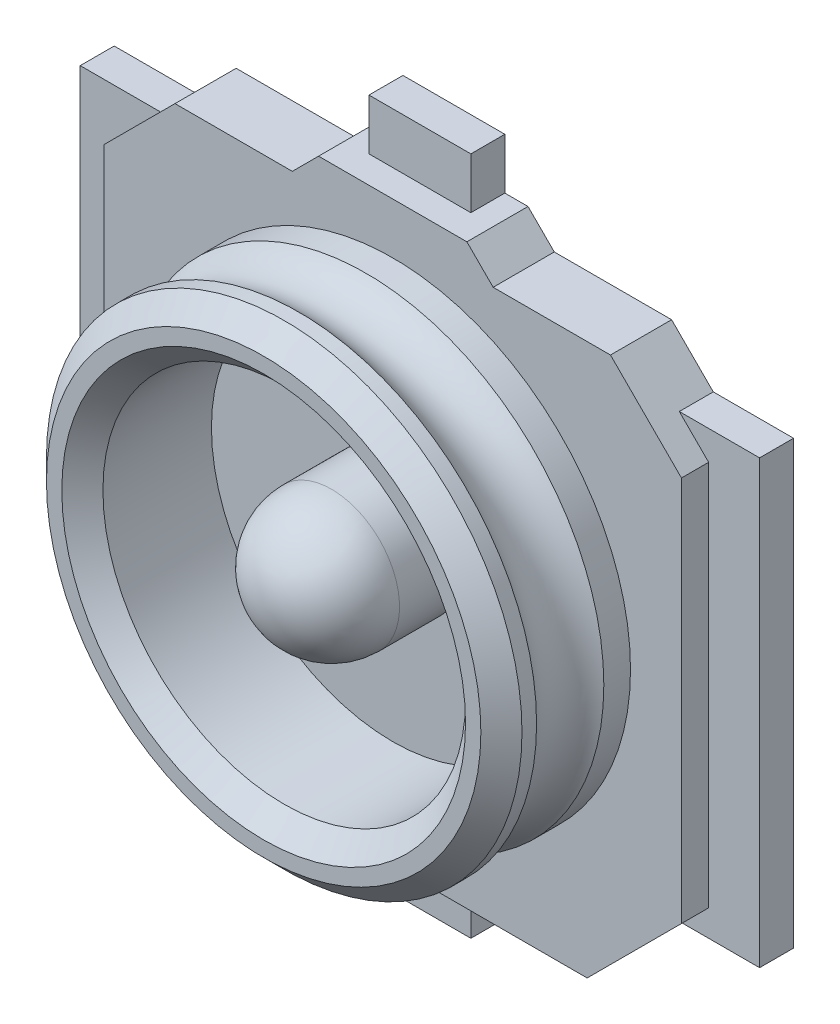
ISO-10303-21;
HEADER;
FILE_DESCRIPTION(('STEP AP214'),'2;1');
FILE_NAME('part.step','',(''),(''),'','','');
FILE_SCHEMA(('AUTOMOTIVE_DESIGN { 1 0 10303 214 1 1 1 1 }'));
ENDSEC;
DATA;
#1=APPLICATION_CONTEXT('core data for automotive mechanical design processes');
#2=APPLICATION_PROTOCOL_DEFINITION('international standard','automotive_design',2000,#1);
#3=PRODUCT_CONTEXT('',#1,'mechanical');
#4=PRODUCT('Part','Part','',(#3));
#5=PRODUCT_RELATED_PRODUCT_CATEGORY('part','',(#4));
#6=PRODUCT_DEFINITION_FORMATION('','',#4);
#7=PRODUCT_DEFINITION_CONTEXT('part definition',#1,'design');
#8=PRODUCT_DEFINITION('design','',#6,#7);
#9=PRODUCT_DEFINITION_SHAPE('','',#8);
#10=(LENGTH_UNIT() NAMED_UNIT(*) SI_UNIT(.MILLI.,.METRE.));
#11=(NAMED_UNIT(*) PLANE_ANGLE_UNIT() SI_UNIT($,.RADIAN.));
#12=(NAMED_UNIT(*) SI_UNIT($,.STERADIAN.) SOLID_ANGLE_UNIT());
#13=UNCERTAINTY_MEASURE_WITH_UNIT(LENGTH_MEASURE(1.E-05),#10,'distance_accuracy_value','');
#14=(GEOMETRIC_REPRESENTATION_CONTEXT(3) GLOBAL_UNCERTAINTY_ASSIGNED_CONTEXT((#13)) GLOBAL_UNIT_ASSIGNED_CONTEXT((#10,
#11,#12)) REPRESENTATION_CONTEXT('',''));
#15=CARTESIAN_POINT('',(0.,0.,0.));
#16=DIRECTION('',(0.,0.,1.));
#17=DIRECTION('',(1.,0.,0.));
#18=AXIS2_PLACEMENT_3D('',#15,#16,#17);
#19=CARTESIAN_POINT('',(0.,0.,0.18));
#20=DIRECTION('',(0.,0.,1.));
#21=DIRECTION('',(1.,0.,0.));
#22=AXIS2_PLACEMENT_3D('',#19,#20,#21);
#23=PLANE('',#22);
#24=DIRECTION('',(-1.,0.,0.));
#25=VECTOR('',#24,1.);
#26=CARTESIAN_POINT('',(0.,0.85,0.18));
#27=LINE('',#26,#25);
#28=CARTESIAN_POINT('',(0.218303032830049,0.85,0.18));
#29=VERTEX_POINT('',#28);
#30=CARTESIAN_POINT('',(-0.218303032830049,0.85,0.18));
#31=VERTEX_POINT('',#30);
#32=EDGE_CURVE('E434',#29,#31,#27,.T.);
#33=ORIENTED_EDGE('',*,*,#32,.T.);
#34=DIRECTION('',(-0.707106781186548,-0.707106781186547,0.));
#35=VECTOR('',#34,1.);
#36=CARTESIAN_POINT('',(-0.218303032830049,0.85,0.18));
#37=LINE('',#36,#35);
#38=CARTESIAN_POINT('',(-0.295625525450462,0.772677507379587,0.18));
#39=VERTEX_POINT('',#38);
#40=EDGE_CURVE('E438',#31,#39,#37,.T.);
#41=ORIENTED_EDGE('',*,*,#40,.T.);
#42=DIRECTION('',(-1.,0.,0.));
#43=VECTOR('',#42,1.);
#44=CARTESIAN_POINT('',(-0.295625525450462,0.772677507379587,0.18));
#45=LINE('',#44,#43);
#46=CARTESIAN_POINT('',(-0.641012318771614,0.772677507379587,0.18));
#47=VERTEX_POINT('',#46);
#48=EDGE_CURVE('E442',#39,#47,#45,.T.);
#49=ORIENTED_EDGE('',*,*,#48,.T.);
#50=DIRECTION('',(-0.707106781186548,-0.707106781186547,0.));
#51=VECTOR('',#50,1.);
#52=CARTESIAN_POINT('',(-0.641012318771614,0.772677507379587,0.18));
#53=LINE('',#52,#51);
#54=CARTESIAN_POINT('',(-0.850000000000001,0.563689826151201,0.18));
#55=VERTEX_POINT('',#54);
#56=EDGE_CURVE('E445',#47,#55,#53,.T.);
#57=ORIENTED_EDGE('',*,*,#56,.T.);
#58=DIRECTION('',(0.,-1.,0.));
#59=VECTOR('',#58,1.);
#60=CARTESIAN_POINT('',(-0.850000000000001,0.563689826151201,0.18));
#61=LINE('',#60,#59);
#62=CARTESIAN_POINT('',(-0.850000000000001,-0.57238461636168,0.18));
#63=VERTEX_POINT('',#62);
#64=EDGE_CURVE('E448',#55,#63,#61,.T.);
#65=ORIENTED_EDGE('',*,*,#64,.T.);
#66=DIRECTION('',(0.707106781186547,-0.707106781186548,0.));
#67=VECTOR('',#66,1.);
#68=CARTESIAN_POINT('',(-0.850000000000001,-0.57238461636168,0.18));
#69=LINE('',#68,#67);
#70=CARTESIAN_POINT('',(-0.572384616361681,-0.85,0.18));
#71=VERTEX_POINT('',#70);
#72=EDGE_CURVE('E451',#63,#71,#69,.T.);
#73=ORIENTED_EDGE('',*,*,#72,.T.);
#74=DIRECTION('',(1.,0.,0.));
#75=VECTOR('',#74,1.);
#76=CARTESIAN_POINT('',(-0.572384616361681,-0.85,0.18));
#77=LINE('',#76,#75);
#78=CARTESIAN_POINT('',(0.572384616361681,-0.85,0.18));
#79=VERTEX_POINT('',#78);
#80=EDGE_CURVE('E454',#71,#79,#77,.T.);
#81=ORIENTED_EDGE('',*,*,#80,.T.);
#82=DIRECTION('',(-0.707106781186547,-0.707106781186548,0.));
#83=VECTOR('',#82,1.);
#84=CARTESIAN_POINT('',(0.850000000000001,-0.57238461636168,0.18));
#85=LINE('',#84,#83);
#86=CARTESIAN_POINT('',(0.850000000000001,-0.57238461636168,0.18));
#87=VERTEX_POINT('',#86);
#88=EDGE_CURVE('E306',#87,#79,#85,.T.);
#89=ORIENTED_EDGE('',*,*,#88,.F.);
#90=DIRECTION('',(0.,-1.,0.));
#91=VECTOR('',#90,1.);
#92=CARTESIAN_POINT('',(0.850000000000001,0.563689826151201,0.18));
#93=LINE('',#92,#91);
#94=CARTESIAN_POINT('',(0.850000000000001,0.563689826151201,0.18));
#95=VERTEX_POINT('',#94);
#96=EDGE_CURVE('E302',#95,#87,#93,.T.);
#97=ORIENTED_EDGE('',*,*,#96,.F.);
#98=DIRECTION('',(0.707106781186548,-0.707106781186547,0.));
#99=VECTOR('',#98,1.);
#100=CARTESIAN_POINT('',(0.641012318771614,0.772677507379587,0.18));
#101=LINE('',#100,#99);
#102=CARTESIAN_POINT('',(0.641012318771614,0.772677507379587,0.18));
#103=VERTEX_POINT('',#102);
#104=EDGE_CURVE('E298',#103,#95,#101,.T.);
#105=ORIENTED_EDGE('',*,*,#104,.F.);
#106=DIRECTION('',(1.,0.,0.));
#107=VECTOR('',#106,1.);
#108=CARTESIAN_POINT('',(0.295625525450462,0.772677507379587,0.18));
#109=LINE('',#108,#107);
#110=CARTESIAN_POINT('',(0.295625525450462,0.772677507379587,0.18));
#111=VERTEX_POINT('',#110);
#112=EDGE_CURVE('E294',#111,#103,#109,.T.);
#113=ORIENTED_EDGE('',*,*,#112,.F.);
#114=DIRECTION('',(0.707106781186548,-0.707106781186547,0.));
#115=VECTOR('',#114,1.);
#116=CARTESIAN_POINT('',(0.218303032830049,0.85,0.18));
#117=LINE('',#116,#115);
#118=EDGE_CURVE('E290',#29,#111,#117,.T.);
#119=ORIENTED_EDGE('',*,*,#118,.F.);
#120=EDGE_LOOP('',(#33,#41,#49,#57,#65,#73,#81,#89,#97,#105,#113,#119));
#121=FACE_BOUND('',#120,.T.);
#122=CARTESIAN_POINT('',(0.,0.,0.18));
#123=DIRECTION('',(0.,0.,-1.));
#124=DIRECTION('',(-1.,0.,0.));
#125=AXIS2_PLACEMENT_3D('',#122,#123,#124);
#126=CIRCLE('',#125,0.7);
#127=CARTESIAN_POINT('',(-0.7,0.,0.18));
#128=VERTEX_POINT('',#127);
#129=EDGE_CURVE('E700',#128,#128,#126,.T.);
#130=ORIENTED_EDGE('',*,*,#129,.T.);
#131=EDGE_LOOP('',(#130));
#132=FACE_BOUND('',#131,.T.);
#133=ADVANCED_FACE('F42',(#121,#132),#23,.T.);
#134=CARTESIAN_POINT('',(-0.641012318771614,0.772677507379587,0.18));
#135=DIRECTION('',(0.707106781186547,-0.707106781186548,0.));
#136=DIRECTION('',(0.707106781186548,0.707106781186547,0.));
#137=AXIS2_PLACEMENT_3D('',#134,#135,#136);
#138=PLANE('',#137);
#139=DIRECTION('',(0.,0.,-1.));
#140=VECTOR('',#139,1.);
#141=CARTESIAN_POINT('',(-0.763689826151202,0.65,0.18));
#142=LINE('',#141,#140);
#143=CARTESIAN_POINT('',(-0.763689826151202,0.65,0.1));
#144=VERTEX_POINT('',#143);
#145=CARTESIAN_POINT('',(-0.763689826151202,0.65,0.));
#146=VERTEX_POINT('',#145);
#147=EDGE_CURVE('E51',#144,#146,#142,.T.);
#148=ORIENTED_EDGE('',*,*,#147,.F.);
#149=DIRECTION('',(0.707106781186548,0.707106781186547,0.));
#150=VECTOR('',#149,1.);
#151=CARTESIAN_POINT('',(-0.641012318771614,0.772677507379587,0.1));
#152=LINE('',#151,#150);
#153=CARTESIAN_POINT('',(-0.850000000000001,0.563689826151201,0.1));
#154=VERTEX_POINT('',#153);
#155=EDGE_CURVE('E414',#154,#144,#152,.T.);
#156=ORIENTED_EDGE('',*,*,#155,.F.);
#157=DIRECTION('',(0.,0.,-1.));
#158=VECTOR('',#157,1.);
#159=CARTESIAN_POINT('',(-0.850000000000001,0.563689826151201,0.18));
#160=LINE('',#159,#158);
#161=EDGE_CURVE('E480',#55,#154,#160,.T.);
#162=ORIENTED_EDGE('',*,*,#161,.F.);
#163=ORIENTED_EDGE('',*,*,#56,.F.);
#164=DIRECTION('',(0.,0.,-1.));
#165=VECTOR('',#164,1.);
#166=CARTESIAN_POINT('',(-0.641012318771614,0.772677507379587,0.18));
#167=LINE('',#166,#165);
#168=CARTESIAN_POINT('',(-0.641012318771614,0.772677507379587,0.));
#169=VERTEX_POINT('',#168);
#170=EDGE_CURVE('E484',#47,#169,#167,.T.);
#171=ORIENTED_EDGE('',*,*,#170,.T.);
#172=DIRECTION('',(-0.707106781186548,-0.707106781186547,0.));
#173=VECTOR('',#172,1.);
#174=CARTESIAN_POINT('',(-0.641012318771614,0.772677507379587,0.));
#175=LINE('',#174,#173);
#176=EDGE_CURVE('E62',#169,#146,#175,.T.);
#177=ORIENTED_EDGE('',*,*,#176,.T.);
#178=EDGE_LOOP('',(#148,#156,#162,#163,#171,#177));
#179=FACE_BOUND('',#178,.T.);
#180=ADVANCED_FACE('F556',(#179),#138,.F.);
#181=CARTESIAN_POINT('',(-0.850000000000001,0.563689826151201,0.18));
#182=DIRECTION('',(1.,0.,0.));
#183=DIRECTION('',(0.,0.,-1.));
#184=AXIS2_PLACEMENT_3D('',#181,#182,#183);
#185=PLANE('',#184);
#186=DIRECTION('',(0.,1.,0.));
#187=VECTOR('',#186,1.);
#188=CARTESIAN_POINT('',(-0.850000000000001,0.563689826151201,0.1));
#189=LINE('',#188,#187);
#190=CARTESIAN_POINT('',(-0.850000000000001,-0.57238461636168,0.1));
#191=VERTEX_POINT('',#190);
#192=EDGE_CURVE('E410',#191,#154,#189,.T.);
#193=ORIENTED_EDGE('',*,*,#192,.F.);
#194=DIRECTION('',(0.,0.,-1.));
#195=VECTOR('',#194,1.);
#196=CARTESIAN_POINT('',(-0.850000000000001,-0.57238461636168,0.18));
#197=LINE('',#196,#195);
#198=EDGE_CURVE('E476',#63,#191,#197,.T.);
#199=ORIENTED_EDGE('',*,*,#198,.F.);
#200=ORIENTED_EDGE('',*,*,#64,.F.);
#201=ORIENTED_EDGE('',*,*,#161,.T.);
#202=EDGE_LOOP('',(#193,#199,#200,#201));
#203=FACE_BOUND('',#202,.T.);
#204=ADVANCED_FACE('F560',(#203),#185,.F.);
#205=CARTESIAN_POINT('',(-0.850000000000001,-0.57238461636168,0.18));
#206=DIRECTION('',(0.707106781186548,0.707106781186547,0.));
#207=DIRECTION('',(-0.707106781186547,0.707106781186548,0.));
#208=AXIS2_PLACEMENT_3D('',#205,#206,#207);
#209=PLANE('',#208);
#210=DIRECTION('',(0.,0.,1.));
#211=VECTOR('',#210,1.);
#212=CARTESIAN_POINT('',(-0.77238461636168,-0.65,0.18));
#213=LINE('',#212,#211);
#214=CARTESIAN_POINT('',(-0.77238461636168,-0.65,0.));
#215=VERTEX_POINT('',#214);
#216=CARTESIAN_POINT('',(-0.77238461636168,-0.65,0.1));
#217=VERTEX_POINT('',#216);
#218=EDGE_CURVE('E531',#215,#217,#213,.T.);
#219=ORIENTED_EDGE('',*,*,#218,.F.);
#220=DIRECTION('',(0.707106781186547,-0.707106781186548,0.));
#221=VECTOR('',#220,1.);
#222=CARTESIAN_POINT('',(-0.850000000000001,-0.57238461636168,0.));
#223=LINE('',#222,#221);
#224=CARTESIAN_POINT('',(-0.572384616361681,-0.85,0.));
#225=VERTEX_POINT('',#224);
#226=EDGE_CURVE('E468',#215,#225,#223,.T.);
#227=ORIENTED_EDGE('',*,*,#226,.T.);
#228=DIRECTION('',(0.,0.,-1.));
#229=VECTOR('',#228,1.);
#230=CARTESIAN_POINT('',(-0.572384616361681,-0.85,0.18));
#231=LINE('',#230,#229);
#232=EDGE_CURVE('E457',#71,#225,#231,.T.);
#233=ORIENTED_EDGE('',*,*,#232,.F.);
#234=ORIENTED_EDGE('',*,*,#72,.F.);
#235=ORIENTED_EDGE('',*,*,#198,.T.);
#236=DIRECTION('',(-0.707106781186547,0.707106781186548,0.));
#237=VECTOR('',#236,1.);
#238=CARTESIAN_POINT('',(-0.850000000000001,-0.57238461636168,0.1));
#239=LINE('',#238,#237);
#240=EDGE_CURVE('E527',#217,#191,#239,.T.);
#241=ORIENTED_EDGE('',*,*,#240,.F.);
#242=EDGE_LOOP('',(#219,#227,#233,#234,#235,#241));
#243=FACE_BOUND('',#242,.T.);
#244=ADVANCED_FACE('F639',(#243),#209,.F.);
#245=CARTESIAN_POINT('',(-0.572384616361681,-0.85,0.18));
#246=DIRECTION('',(0.,1.,0.));
#247=DIRECTION('',(0.,0.,1.));
#248=AXIS2_PLACEMENT_3D('',#245,#246,#247);
#249=PLANE('',#248);
#250=DIRECTION('',(0.,0.,-1.));
#251=VECTOR('',#250,1.);
#252=CARTESIAN_POINT('',(-0.15,-0.85,0.18));
#253=LINE('',#252,#251);
#254=CARTESIAN_POINT('',(-0.15,-0.85,0.1));
#255=VERTEX_POINT('',#254);
#256=CARTESIAN_POINT('',(-0.15,-0.85,0.));
#257=VERTEX_POINT('',#256);
#258=EDGE_CURVE('E523',#255,#257,#253,.T.);
#259=ORIENTED_EDGE('',*,*,#258,.F.);
#260=DIRECTION('',(-1.,0.,0.));
#261=VECTOR('',#260,1.);
#262=CARTESIAN_POINT('',(-0.572384616361681,-0.85,0.1));
#263=LINE('',#262,#261);
#264=CARTESIAN_POINT('',(0.15,-0.85,0.1));
#265=VERTEX_POINT('',#264);
#266=EDGE_CURVE('E519',#265,#255,#263,.T.);
#267=ORIENTED_EDGE('',*,*,#266,.F.);
#268=DIRECTION('',(0.,0.,-1.));
#269=VECTOR('',#268,1.);
#270=CARTESIAN_POINT('',(0.15,-0.85,0.18));
#271=LINE('',#270,#269);
#272=CARTESIAN_POINT('',(0.15,-0.85,0.));
#273=VERTEX_POINT('',#272);
#274=EDGE_CURVE('E369',#265,#273,#271,.T.);
#275=ORIENTED_EDGE('',*,*,#274,.T.);
#276=DIRECTION('',(-1.,0.,0.));
#277=VECTOR('',#276,1.);
#278=CARTESIAN_POINT('',(0.572384616361681,-0.85,0.));
#279=LINE('',#278,#277);
#280=CARTESIAN_POINT('',(0.572384616361681,-0.85,0.));
#281=VERTEX_POINT('',#280);
#282=EDGE_CURVE('E295',#281,#273,#279,.T.);
#283=ORIENTED_EDGE('',*,*,#282,.F.);
#284=DIRECTION('',(0.,0.,-1.));
#285=VECTOR('',#284,1.);
#286=CARTESIAN_POINT('',(0.572384616361681,-0.85,0.18));
#287=LINE('',#286,#285);
#288=EDGE_CURVE('E310',#79,#281,#287,.T.);
#289=ORIENTED_EDGE('',*,*,#288,.F.);
#290=ORIENTED_EDGE('',*,*,#80,.F.);
#291=ORIENTED_EDGE('',*,*,#232,.T.);
#292=DIRECTION('',(1.,0.,0.));
#293=VECTOR('',#292,1.);
#294=CARTESIAN_POINT('',(-0.572384616361681,-0.85,0.));
#295=LINE('',#294,#293);
#296=EDGE_CURVE('E439',#225,#257,#295,.T.);
#297=ORIENTED_EDGE('',*,*,#296,.T.);
#298=EDGE_LOOP('',(#259,#267,#275,#283,#289,#290,#291,#297));
#299=FACE_BOUND('',#298,.T.);
#300=ADVANCED_FACE('F622',(#299),#249,.F.);
#301=CARTESIAN_POINT('',(-0.15,1.,0.1));
#302=DIRECTION('',(1.,0.,0.));
#303=DIRECTION('',(0.,0.,-1.));
#304=AXIS2_PLACEMENT_3D('',#301,#302,#303);
#305=PLANE('',#304);
#306=DIRECTION('',(0.,0.,-1.));
#307=VECTOR('',#306,1.);
#308=CARTESIAN_POINT('',(-0.15,0.85,0.1));
#309=LINE('',#308,#307);
#310=CARTESIAN_POINT('',(-0.15,0.85,0.1));
#311=VERTEX_POINT('',#310);
#312=CARTESIAN_POINT('',(-0.15,0.85,0.));
#313=VERTEX_POINT('',#312);
#314=EDGE_CURVE('E498',#311,#313,#309,.T.);
#315=ORIENTED_EDGE('',*,*,#314,.F.);
#316=DIRECTION('',(0.,-1.,0.));
#317=VECTOR('',#316,1.);
#318=CARTESIAN_POINT('',(-0.15,1.,0.1));
#319=LINE('',#318,#317);
#320=CARTESIAN_POINT('',(-0.15,1.,0.1));
#321=VERTEX_POINT('',#320);
#322=EDGE_CURVE('E506',#321,#311,#319,.T.);
#323=ORIENTED_EDGE('',*,*,#322,.F.);
#324=DIRECTION('',(0.,0.,-1.));
#325=VECTOR('',#324,1.);
#326=CARTESIAN_POINT('',(-0.15,1.,0.1));
#327=LINE('',#326,#325);
#328=CARTESIAN_POINT('',(-0.15,1.,0.));
#329=VERTEX_POINT('',#328);
#330=EDGE_CURVE('E511',#321,#329,#327,.T.);
#331=ORIENTED_EDGE('',*,*,#330,.T.);
#332=DIRECTION('',(0.,-1.,0.));
#333=VECTOR('',#332,1.);
#334=CARTESIAN_POINT('',(-0.15,1.,0.));
#335=LINE('',#334,#333);
#336=EDGE_CURVE('E507',#329,#313,#335,.T.);
#337=ORIENTED_EDGE('',*,*,#336,.T.);
#338=EDGE_LOOP('',(#315,#323,#331,#337));
#339=FACE_BOUND('',#338,.T.);
#340=ADVANCED_FACE('F584',(#339),#305,.F.);
#341=CARTESIAN_POINT('',(0.,0.,0.1));
#342=DIRECTION('',(0.,0.,1.));
#343=DIRECTION('',(1.,0.,0.));
#344=AXIS2_PLACEMENT_3D('',#341,#342,#343);
#345=PLANE('',#344);
#346=ORIENTED_EDGE('',*,*,#322,.T.);
#347=DIRECTION('',(1.,0.,0.));
#348=VECTOR('',#347,1.);
#349=CARTESIAN_POINT('',(0.,0.85,0.1));
#350=LINE('',#349,#348);
#351=CARTESIAN_POINT('',(0.15,0.85,0.1));
#352=VERTEX_POINT('',#351);
#353=EDGE_CURVE('E495',#311,#352,#350,.T.);
#354=ORIENTED_EDGE('',*,*,#353,.T.);
#355=DIRECTION('',(0.,-1.,0.));
#356=VECTOR('',#355,1.);
#357=CARTESIAN_POINT('',(0.15,1.,0.1));
#358=LINE('',#357,#356);
#359=CARTESIAN_POINT('',(0.15,1.,0.1));
#360=VERTEX_POINT('',#359);
#361=EDGE_CURVE('E358',#360,#352,#358,.T.);
#362=ORIENTED_EDGE('',*,*,#361,.F.);
#363=DIRECTION('',(-1.,0.,0.));
#364=VECTOR('',#363,1.);
#365=CARTESIAN_POINT('',(0.,1.,0.1));
#366=LINE('',#365,#364);
#367=EDGE_CURVE('E503',#360,#321,#366,.T.);
#368=ORIENTED_EDGE('',*,*,#367,.T.);
#369=EDGE_LOOP('',(#346,#354,#362,#368));
#370=FACE_BOUND('',#369,.T.);
#371=ADVANCED_FACE('F586',(#370),#345,.T.);
#372=CARTESIAN_POINT('',(0.,1.,0.1));
#373=DIRECTION('',(0.,-1.,0.));
#374=DIRECTION('',(0.,0.,-1.));
#375=AXIS2_PLACEMENT_3D('',#372,#373,#374);
#376=PLANE('',#375);
#377=DIRECTION('',(-1.,0.,0.));
#378=VECTOR('',#377,1.);
#379=CARTESIAN_POINT('',(0.,1.,0.));
#380=LINE('',#379,#378);
#381=CARTESIAN_POINT('',(0.15,1.,0.));
#382=VERTEX_POINT('',#381);
#383=EDGE_CURVE('E502',#382,#329,#380,.T.);
#384=ORIENTED_EDGE('',*,*,#383,.T.);
#385=ORIENTED_EDGE('',*,*,#330,.F.);
#386=ORIENTED_EDGE('',*,*,#367,.F.);
#387=DIRECTION('',(0.,0.,-1.));
#388=VECTOR('',#387,1.);
#389=CARTESIAN_POINT('',(0.15,1.,0.1));
#390=LINE('',#389,#388);
#391=EDGE_CURVE('E362',#360,#382,#390,.T.);
#392=ORIENTED_EDGE('',*,*,#391,.T.);
#393=EDGE_LOOP('',(#384,#385,#386,#392));
#394=FACE_BOUND('',#393,.T.);
#395=ADVANCED_FACE('F591',(#394),#376,.F.);
#396=CARTESIAN_POINT('',(0.,0.,0.));
#397=DIRECTION('',(0.,0.,1.));
#398=DIRECTION('',(1.,0.,0.));
#399=AXIS2_PLACEMENT_3D('',#396,#397,#398);
#400=PLANE('',#399);
#401=DIRECTION('',(-1.,0.,0.));
#402=VECTOR('',#401,1.);
#403=CARTESIAN_POINT('',(-1.,0.65,0.));
#404=LINE('',#403,#402);
#405=CARTESIAN_POINT('',(-1.,0.65,0.));
#406=VERTEX_POINT('',#405);
#407=EDGE_CURVE('E382',#146,#406,#404,.T.);
#408=ORIENTED_EDGE('',*,*,#407,.F.);
#409=ORIENTED_EDGE('',*,*,#176,.F.);
#410=DIRECTION('',(-1.,0.,0.));
#411=VECTOR('',#410,1.);
#412=CARTESIAN_POINT('',(-0.295625525450462,0.772677507379587,0.));
#413=LINE('',#412,#411);
#414=CARTESIAN_POINT('',(-0.295625525450462,0.772677507379587,0.));
#415=VERTEX_POINT('',#414);
#416=EDGE_CURVE('E463',#415,#169,#413,.T.);
#417=ORIENTED_EDGE('',*,*,#416,.F.);
#418=DIRECTION('',(-0.707106781186548,-0.707106781186547,0.));
#419=VECTOR('',#418,1.);
#420=CARTESIAN_POINT('',(-0.218303032830049,0.85,0.));
#421=LINE('',#420,#419);
#422=CARTESIAN_POINT('',(-0.218303032830049,0.85,0.));
#423=VERTEX_POINT('',#422);
#424=EDGE_CURVE('E460',#423,#415,#421,.T.);
#425=ORIENTED_EDGE('',*,*,#424,.F.);
#426=DIRECTION('',(-1.,0.,0.));
#427=VECTOR('',#426,1.);
#428=CARTESIAN_POINT('',(0.,0.85,0.));
#429=LINE('',#428,#427);
#430=EDGE_CURVE('E433',#313,#423,#429,.T.);
#431=ORIENTED_EDGE('',*,*,#430,.F.);
#432=ORIENTED_EDGE('',*,*,#336,.F.);
#433=ORIENTED_EDGE('',*,*,#383,.F.);
#434=DIRECTION('',(0.,-1.,0.));
#435=VECTOR('',#434,1.);
#436=CARTESIAN_POINT('',(0.15,1.,0.));
#437=LINE('',#436,#435);
#438=CARTESIAN_POINT('',(0.15,0.85,0.));
#439=VERTEX_POINT('',#438);
#440=EDGE_CURVE('E357',#382,#439,#437,.T.);
#441=ORIENTED_EDGE('',*,*,#440,.T.);
#442=DIRECTION('',(1.,0.,0.));
#443=VECTOR('',#442,1.);
#444=CARTESIAN_POINT('',(0.,0.85,0.));
#445=LINE('',#444,#443);
#446=CARTESIAN_POINT('',(0.218303032830049,0.85,0.));
#447=VERTEX_POINT('',#446);
#448=EDGE_CURVE('E289',#439,#447,#445,.T.);
#449=ORIENTED_EDGE('',*,*,#448,.T.);
#450=DIRECTION('',(0.707106781186548,-0.707106781186547,0.));
#451=VECTOR('',#450,1.);
#452=CARTESIAN_POINT('',(0.218303032830049,0.85,0.));
#453=LINE('',#452,#451);
#454=CARTESIAN_POINT('',(0.295625525450462,0.772677507379587,0.));
#455=VERTEX_POINT('',#454);
#456=EDGE_CURVE('E314',#447,#455,#453,.T.);
#457=ORIENTED_EDGE('',*,*,#456,.T.);
#458=DIRECTION('',(1.,0.,0.));
#459=VECTOR('',#458,1.);
#460=CARTESIAN_POINT('',(0.295625525450462,0.772677507379587,0.));
#461=LINE('',#460,#459);
#462=CARTESIAN_POINT('',(0.641012318771614,0.772677507379587,0.));
#463=VERTEX_POINT('',#462);
#464=EDGE_CURVE('E318',#455,#463,#461,.T.);
#465=ORIENTED_EDGE('',*,*,#464,.T.);
#466=DIRECTION('',(0.707106781186548,-0.707106781186547,0.));
#467=VECTOR('',#466,1.);
#468=CARTESIAN_POINT('',(0.641012318771614,0.772677507379587,0.));
#469=LINE('',#468,#467);
#470=CARTESIAN_POINT('',(0.763689826151202,0.65,0.));
#471=VERTEX_POINT('',#470);
#472=EDGE_CURVE('E321',#463,#471,#469,.T.);
#473=ORIENTED_EDGE('',*,*,#472,.T.);
#474=DIRECTION('',(1.,0.,0.));
#475=VECTOR('',#474,1.);
#476=CARTESIAN_POINT('',(1.,0.65,0.));
#477=LINE('',#476,#475);
#478=CARTESIAN_POINT('',(1.,0.65,0.));
#479=VERTEX_POINT('',#478);
#480=EDGE_CURVE('E265',#471,#479,#477,.T.);
#481=ORIENTED_EDGE('',*,*,#480,.T.);
#482=DIRECTION('',(0.,-1.,0.));
#483=VECTOR('',#482,1.);
#484=CARTESIAN_POINT('',(1.,-0.65,0.));
#485=LINE('',#484,#483);
#486=CARTESIAN_POINT('',(1.,-0.65,0.));
#487=VERTEX_POINT('',#486);
#488=EDGE_CURVE('E243',#479,#487,#485,.T.);
#489=ORIENTED_EDGE('',*,*,#488,.T.);
#490=DIRECTION('',(-1.,0.,0.));
#491=VECTOR('',#490,1.);
#492=CARTESIAN_POINT('',(1.,-0.65,0.));
#493=LINE('',#492,#491);
#494=CARTESIAN_POINT('',(0.77238461636168,-0.65,0.));
#495=VERTEX_POINT('',#494);
#496=EDGE_CURVE('E255',#487,#495,#493,.T.);
#497=ORIENTED_EDGE('',*,*,#496,.T.);
#498=DIRECTION('',(-0.707106781186547,-0.707106781186548,0.));
#499=VECTOR('',#498,1.);
#500=CARTESIAN_POINT('',(0.850000000000001,-0.57238461636168,0.));
#501=LINE('',#500,#499);
#502=EDGE_CURVE('E325',#495,#281,#501,.T.);
#503=ORIENTED_EDGE('',*,*,#502,.T.);
#504=ORIENTED_EDGE('',*,*,#282,.T.);
#505=DIRECTION('',(0.,-1.,0.));
#506=VECTOR('',#505,1.);
#507=CARTESIAN_POINT('',(0.15,-0.7,0.));
#508=LINE('',#507,#506);
#509=CARTESIAN_POINT('',(0.15,-1.,0.));
#510=VERTEX_POINT('',#509);
#511=EDGE_CURVE('E277',#273,#510,#508,.T.);
#512=ORIENTED_EDGE('',*,*,#511,.T.);
#513=DIRECTION('',(1.,0.,0.));
#514=VECTOR('',#513,1.);
#515=CARTESIAN_POINT('',(0.,-1.,0.));
#516=LINE('',#515,#514);
#517=CARTESIAN_POINT('',(-0.15,-1.,0.));
#518=VERTEX_POINT('',#517);
#519=EDGE_CURVE('E422',#518,#510,#516,.T.);
#520=ORIENTED_EDGE('',*,*,#519,.F.);
#521=DIRECTION('',(0.,-1.,0.));
#522=VECTOR('',#521,1.);
#523=CARTESIAN_POINT('',(-0.15,-0.7,0.));
#524=LINE('',#523,#522);
#525=EDGE_CURVE('E417',#257,#518,#524,.T.);
#526=ORIENTED_EDGE('',*,*,#525,.F.);
#527=ORIENTED_EDGE('',*,*,#296,.F.);
#528=ORIENTED_EDGE('',*,*,#226,.F.);
#529=DIRECTION('',(1.,0.,0.));
#530=VECTOR('',#529,1.);
#531=CARTESIAN_POINT('',(-1.,-0.65,0.));
#532=LINE('',#531,#530);
#533=CARTESIAN_POINT('',(-1.,-0.65,0.));
#534=VERTEX_POINT('',#533);
#535=EDGE_CURVE('E387',#534,#215,#532,.T.);
#536=ORIENTED_EDGE('',*,*,#535,.F.);
#537=DIRECTION('',(0.,-1.,0.));
#538=VECTOR('',#537,1.);
#539=CARTESIAN_POINT('',(-1.,-0.65,0.));
#540=LINE('',#539,#538);
#541=EDGE_CURVE('E397',#406,#534,#540,.T.);
#542=ORIENTED_EDGE('',*,*,#541,.F.);
#543=EDGE_LOOP('',(#408,#409,#417,#425,#431,#432,#433,#441,#449,#457,#465,#473,#481,#489,#497,
#503,#504,#512,#520,#526,#527,#528,#536,#542));
#544=FACE_BOUND('',#543,.T.);
#545=ADVANCED_FACE('F542',(#544),#400,.F.);
#546=CARTESIAN_POINT('',(0.,0.85,0.18));
#547=DIRECTION('',(0.,-1.,0.));
#548=DIRECTION('',(0.,0.,-1.));
#549=AXIS2_PLACEMENT_3D('',#546,#547,#548);
#550=PLANE('',#549);
#551=ORIENTED_EDGE('',*,*,#353,.F.);
#552=ORIENTED_EDGE('',*,*,#314,.T.);
#553=ORIENTED_EDGE('',*,*,#430,.T.);
#554=DIRECTION('',(0.,0.,-1.));
#555=VECTOR('',#554,1.);
#556=CARTESIAN_POINT('',(-0.218303032830049,0.85,0.18));
#557=LINE('',#556,#555);
#558=EDGE_CURVE('E491',#31,#423,#557,.T.);
#559=ORIENTED_EDGE('',*,*,#558,.F.);
#560=ORIENTED_EDGE('',*,*,#32,.F.);
#561=DIRECTION('',(0.,0.,-1.));
#562=VECTOR('',#561,1.);
#563=CARTESIAN_POINT('',(0.218303032830049,0.85,0.18));
#564=LINE('',#563,#562);
#565=EDGE_CURVE('E350',#29,#447,#564,.T.);
#566=ORIENTED_EDGE('',*,*,#565,.T.);
#567=ORIENTED_EDGE('',*,*,#448,.F.);
#568=DIRECTION('',(0.,0.,-1.));
#569=VECTOR('',#568,1.);
#570=CARTESIAN_POINT('',(0.15,0.85,0.1));
#571=LINE('',#570,#569);
#572=EDGE_CURVE('E353',#352,#439,#571,.T.);
#573=ORIENTED_EDGE('',*,*,#572,.F.);
#574=EDGE_LOOP('',(#551,#552,#553,#559,#560,#566,#567,#573));
#575=FACE_BOUND('',#574,.T.);
#576=ADVANCED_FACE('F579',(#575),#550,.F.);
#577=CARTESIAN_POINT('',(-0.218303032830049,0.85,0.18));
#578=DIRECTION('',(0.707106781186547,-0.707106781186548,0.));
#579=DIRECTION('',(0.707106781186548,0.707106781186547,0.));
#580=AXIS2_PLACEMENT_3D('',#577,#578,#579);
#581=PLANE('',#580);
#582=ORIENTED_EDGE('',*,*,#424,.T.);
#583=DIRECTION('',(0.,0.,-1.));
#584=VECTOR('',#583,1.);
#585=CARTESIAN_POINT('',(-0.295625525450462,0.772677507379587,0.18));
#586=LINE('',#585,#584);
#587=EDGE_CURVE('E487',#39,#415,#586,.T.);
#588=ORIENTED_EDGE('',*,*,#587,.F.);
#589=ORIENTED_EDGE('',*,*,#40,.F.);
#590=ORIENTED_EDGE('',*,*,#558,.T.);
#591=EDGE_LOOP('',(#582,#588,#589,#590));
#592=FACE_BOUND('',#591,.T.);
#593=ADVANCED_FACE('F576',(#592),#581,.F.);
#594=CARTESIAN_POINT('',(-0.295625525450462,0.772677507379587,0.18));
#595=DIRECTION('',(0.,-1.,0.));
#596=DIRECTION('',(0.,0.,-1.));
#597=AXIS2_PLACEMENT_3D('',#594,#595,#596);
#598=PLANE('',#597);
#599=ORIENTED_EDGE('',*,*,#416,.T.);
#600=ORIENTED_EDGE('',*,*,#170,.F.);
#601=ORIENTED_EDGE('',*,*,#48,.F.);
#602=ORIENTED_EDGE('',*,*,#587,.T.);
#603=EDGE_LOOP('',(#599,#600,#601,#602));
#604=FACE_BOUND('',#603,.T.);
#605=ADVANCED_FACE('F569',(#604),#598,.F.);
#606=CARTESIAN_POINT('',(-0.15,-0.7,0.1));
#607=DIRECTION('',(1.,0.,0.));
#608=DIRECTION('',(0.,1.,0.));
#609=AXIS2_PLACEMENT_3D('',#606,#607,#608);
#610=PLANE('',#609);
#611=DIRECTION('',(0.,-1.,0.));
#612=VECTOR('',#611,1.);
#613=CARTESIAN_POINT('',(-0.15,-0.7,0.1));
#614=LINE('',#613,#612);
#615=CARTESIAN_POINT('',(-0.15,-1.,0.1));
#616=VERTEX_POINT('',#615);
#617=EDGE_CURVE('E418',#255,#616,#614,.T.);
#618=ORIENTED_EDGE('',*,*,#617,.F.);
#619=ORIENTED_EDGE('',*,*,#258,.T.);
#620=ORIENTED_EDGE('',*,*,#525,.T.);
#621=DIRECTION('',(0.,0.,-1.));
#622=VECTOR('',#621,1.);
#623=CARTESIAN_POINT('',(-0.15,-1.,0.1));
#624=LINE('',#623,#622);
#625=EDGE_CURVE('E425',#616,#518,#624,.T.);
#626=ORIENTED_EDGE('',*,*,#625,.F.);
#627=EDGE_LOOP('',(#618,#619,#620,#626));
#628=FACE_BOUND('',#627,.T.);
#629=ADVANCED_FACE('F636',(#628),#610,.F.);
#630=CARTESIAN_POINT('',(0.,0.,0.1));
#631=DIRECTION('',(0.,0.,-1.));
#632=DIRECTION('',(-1.,0.,0.));
#633=AXIS2_PLACEMENT_3D('',#630,#631,#632);
#634=PLANE('',#633);
#635=DIRECTION('',(1.,0.,0.));
#636=VECTOR('',#635,1.);
#637=CARTESIAN_POINT('',(0.,-1.,0.1));
#638=LINE('',#637,#636);
#639=CARTESIAN_POINT('',(0.15,-1.,0.1));
#640=VERTEX_POINT('',#639);
#641=EDGE_CURVE('E421',#616,#640,#638,.T.);
#642=ORIENTED_EDGE('',*,*,#641,.T.);
#643=DIRECTION('',(0.,-1.,0.));
#644=VECTOR('',#643,1.);
#645=CARTESIAN_POINT('',(0.15,-0.7,0.1));
#646=LINE('',#645,#644);
#647=EDGE_CURVE('E278',#265,#640,#646,.T.);
#648=ORIENTED_EDGE('',*,*,#647,.F.);
#649=ORIENTED_EDGE('',*,*,#266,.T.);
#650=ORIENTED_EDGE('',*,*,#617,.T.);
#651=EDGE_LOOP('',(#642,#648,#649,#650));
#652=FACE_BOUND('',#651,.T.);
#653=ADVANCED_FACE('F777',(#652),#634,.F.);
#654=CARTESIAN_POINT('',(0.,-1.,0.1));
#655=DIRECTION('',(0.,1.,0.));
#656=DIRECTION('',(0.,0.,1.));
#657=AXIS2_PLACEMENT_3D('',#654,#655,#656);
#658=PLANE('',#657);
#659=ORIENTED_EDGE('',*,*,#519,.T.);
#660=DIRECTION('',(0.,0.,-1.));
#661=VECTOR('',#660,1.);
#662=CARTESIAN_POINT('',(0.15,-1.,0.1));
#663=LINE('',#662,#661);
#664=EDGE_CURVE('E282',#640,#510,#663,.T.);
#665=ORIENTED_EDGE('',*,*,#664,.F.);
#666=ORIENTED_EDGE('',*,*,#641,.F.);
#667=ORIENTED_EDGE('',*,*,#625,.T.);
#668=EDGE_LOOP('',(#659,#665,#666,#667));
#669=FACE_BOUND('',#668,.T.);
#670=ADVANCED_FACE('F632',(#669),#658,.F.);
#671=CARTESIAN_POINT('',(-1.,0.65,0.1));
#672=DIRECTION('',(0.,-1.,0.));
#673=DIRECTION('',(0.,0.,-1.));
#674=AXIS2_PLACEMENT_3D('',#671,#672,#673);
#675=PLANE('',#674);
#676=DIRECTION('',(-1.,0.,0.));
#677=VECTOR('',#676,1.);
#678=CARTESIAN_POINT('',(-1.,0.65,0.1));
#679=LINE('',#678,#677);
#680=CARTESIAN_POINT('',(-1.,0.65,0.1));
#681=VERTEX_POINT('',#680);
#682=EDGE_CURVE('E383',#144,#681,#679,.T.);
#683=ORIENTED_EDGE('',*,*,#682,.F.);
#684=ORIENTED_EDGE('',*,*,#147,.T.);
#685=ORIENTED_EDGE('',*,*,#407,.T.);
#686=DIRECTION('',(0.,0.,-1.));
#687=VECTOR('',#686,1.);
#688=CARTESIAN_POINT('',(-1.,0.65,0.1));
#689=LINE('',#688,#687);
#690=EDGE_CURVE('E406',#681,#406,#689,.T.);
#691=ORIENTED_EDGE('',*,*,#690,.F.);
#692=EDGE_LOOP('',(#683,#684,#685,#691));
#693=FACE_BOUND('',#692,.T.);
#694=ADVANCED_FACE('F538',(#693),#675,.F.);
#695=CARTESIAN_POINT('',(-1.,-0.65,0.1));
#696=DIRECTION('',(0.,1.,0.));
#697=DIRECTION('',(0.,0.,1.));
#698=AXIS2_PLACEMENT_3D('',#695,#696,#697);
#699=PLANE('',#698);
#700=ORIENTED_EDGE('',*,*,#535,.T.);
#701=ORIENTED_EDGE('',*,*,#218,.T.);
#702=DIRECTION('',(1.,0.,0.));
#703=VECTOR('',#702,1.);
#704=CARTESIAN_POINT('',(-1.,-0.65,0.1));
#705=LINE('',#704,#703);
#706=CARTESIAN_POINT('',(-1.,-0.65,0.1));
#707=VERTEX_POINT('',#706);
#708=EDGE_CURVE('E390',#707,#217,#705,.T.);
#709=ORIENTED_EDGE('',*,*,#708,.F.);
#710=DIRECTION('',(0.,0.,-1.));
#711=VECTOR('',#710,1.);
#712=CARTESIAN_POINT('',(-1.,-0.65,0.1));
#713=LINE('',#712,#711);
#714=EDGE_CURVE('E394',#707,#534,#713,.T.);
#715=ORIENTED_EDGE('',*,*,#714,.T.);
#716=EDGE_LOOP('',(#700,#701,#709,#715));
#717=FACE_BOUND('',#716,.T.);
#718=ADVANCED_FACE('F551',(#717),#699,.F.);
#719=CARTESIAN_POINT('',(0.,0.,0.1));
#720=DIRECTION('',(0.,0.,-1.));
#721=DIRECTION('',(-1.,0.,0.));
#722=AXIS2_PLACEMENT_3D('',#719,#720,#721);
#723=PLANE('',#722);
#724=ORIENTED_EDGE('',*,*,#192,.T.);
#725=ORIENTED_EDGE('',*,*,#155,.T.);
#726=ORIENTED_EDGE('',*,*,#682,.T.);
#727=DIRECTION('',(0.,-1.,0.));
#728=VECTOR('',#727,1.);
#729=CARTESIAN_POINT('',(-1.,-0.65,0.1));
#730=LINE('',#729,#728);
#731=EDGE_CURVE('E386',#681,#707,#730,.T.);
#732=ORIENTED_EDGE('',*,*,#731,.T.);
#733=ORIENTED_EDGE('',*,*,#708,.T.);
#734=ORIENTED_EDGE('',*,*,#240,.T.);
#735=EDGE_LOOP('',(#724,#725,#726,#732,#733,#734));
#736=FACE_BOUND('',#735,.T.);
#737=ADVANCED_FACE('F554',(#736),#723,.F.);
#738=CARTESIAN_POINT('',(-1.,-0.65,0.1));
#739=DIRECTION('',(1.,0.,0.));
#740=DIRECTION('',(0.,1.,0.));
#741=AXIS2_PLACEMENT_3D('',#738,#739,#740);
#742=PLANE('',#741);
#743=ORIENTED_EDGE('',*,*,#541,.T.);
#744=ORIENTED_EDGE('',*,*,#714,.F.);
#745=ORIENTED_EDGE('',*,*,#731,.F.);
#746=ORIENTED_EDGE('',*,*,#690,.T.);
#747=EDGE_LOOP('',(#743,#744,#745,#746));
#748=FACE_BOUND('',#747,.T.);
#749=ADVANCED_FACE('F547',(#748),#742,.F.);
#750=CARTESIAN_POINT('',(0.641012318771614,0.772677507379587,0.18));
#751=DIRECTION('',(-0.707106781186547,-0.707106781186548,0.));
#752=DIRECTION('',(-0.707106781186548,0.707106781186547,0.));
#753=AXIS2_PLACEMENT_3D('',#750,#751,#752);
#754=PLANE('',#753);
#755=DIRECTION('',(0.,0.,-1.));
#756=VECTOR('',#755,1.);
#757=CARTESIAN_POINT('',(0.763689826151202,0.65,0.18));
#758=LINE('',#757,#756);
#759=CARTESIAN_POINT('',(0.763689826151202,0.65,0.1));
#760=VERTEX_POINT('',#759);
#761=EDGE_CURVE('E253',#760,#471,#758,.T.);
#762=ORIENTED_EDGE('',*,*,#761,.T.);
#763=ORIENTED_EDGE('',*,*,#472,.F.);
#764=DIRECTION('',(0.,0.,-1.));
#765=VECTOR('',#764,1.);
#766=CARTESIAN_POINT('',(0.641012318771614,0.772677507379587,0.18));
#767=LINE('',#766,#765);
#768=EDGE_CURVE('E343',#103,#463,#767,.T.);
#769=ORIENTED_EDGE('',*,*,#768,.F.);
#770=ORIENTED_EDGE('',*,*,#104,.T.);
#771=DIRECTION('',(0.,0.,-1.));
#772=VECTOR('',#771,1.);
#773=CARTESIAN_POINT('',(0.850000000000001,0.563689826151201,0.18));
#774=LINE('',#773,#772);
#775=CARTESIAN_POINT('',(0.850000000000001,0.563689826151201,0.1));
#776=VERTEX_POINT('',#775);
#777=EDGE_CURVE('E339',#95,#776,#774,.T.);
#778=ORIENTED_EDGE('',*,*,#777,.T.);
#779=DIRECTION('',(-0.707106781186548,0.707106781186547,0.));
#780=VECTOR('',#779,1.);
#781=CARTESIAN_POINT('',(0.641012318771614,0.772677507379587,0.1));
#782=LINE('',#781,#780);
#783=EDGE_CURVE('E274',#776,#760,#782,.T.);
#784=ORIENTED_EDGE('',*,*,#783,.T.);
#785=EDGE_LOOP('',(#762,#763,#769,#770,#778,#784));
#786=FACE_BOUND('',#785,.T.);
#787=ADVANCED_FACE('F607',(#786),#754,.F.);
#788=CARTESIAN_POINT('',(0.850000000000001,0.563689826151201,0.18));
#789=DIRECTION('',(-1.,0.,0.));
#790=DIRECTION('',(0.,0.,-1.));
#791=AXIS2_PLACEMENT_3D('',#788,#789,#790);
#792=PLANE('',#791);
#793=DIRECTION('',(0.,1.,0.));
#794=VECTOR('',#793,1.);
#795=CARTESIAN_POINT('',(0.850000000000001,0.563689826151201,0.1));
#796=LINE('',#795,#794);
#797=CARTESIAN_POINT('',(0.850000000000001,-0.57238461636168,0.1));
#798=VERTEX_POINT('',#797);
#799=EDGE_CURVE('E247',#798,#776,#796,.T.);
#800=ORIENTED_EDGE('',*,*,#799,.T.);
#801=ORIENTED_EDGE('',*,*,#777,.F.);
#802=ORIENTED_EDGE('',*,*,#96,.T.);
#803=DIRECTION('',(0.,0.,-1.));
#804=VECTOR('',#803,1.);
#805=CARTESIAN_POINT('',(0.850000000000001,-0.57238461636168,0.18));
#806=LINE('',#805,#804);
#807=EDGE_CURVE('E335',#87,#798,#806,.T.);
#808=ORIENTED_EDGE('',*,*,#807,.T.);
#809=EDGE_LOOP('',(#800,#801,#802,#808));
#810=FACE_BOUND('',#809,.T.);
#811=ADVANCED_FACE('F618',(#810),#792,.F.);
#812=CARTESIAN_POINT('',(0.850000000000001,-0.57238461636168,0.18));
#813=DIRECTION('',(-0.707106781186548,0.707106781186547,0.));
#814=DIRECTION('',(0.707106781186547,0.707106781186548,0.));
#815=AXIS2_PLACEMENT_3D('',#812,#813,#814);
#816=PLANE('',#815);
#817=DIRECTION('',(0.,0.,1.));
#818=VECTOR('',#817,1.);
#819=CARTESIAN_POINT('',(0.77238461636168,-0.65,0.18));
#820=LINE('',#819,#818);
#821=CARTESIAN_POINT('',(0.77238461636168,-0.65,0.1));
#822=VERTEX_POINT('',#821);
#823=EDGE_CURVE('E376',#495,#822,#820,.T.);
#824=ORIENTED_EDGE('',*,*,#823,.T.);
#825=DIRECTION('',(0.707106781186547,0.707106781186548,0.));
#826=VECTOR('',#825,1.);
#827=CARTESIAN_POINT('',(0.850000000000001,-0.57238461636168,0.1));
#828=LINE('',#827,#826);
#829=EDGE_CURVE('E373',#822,#798,#828,.T.);
#830=ORIENTED_EDGE('',*,*,#829,.T.);
#831=ORIENTED_EDGE('',*,*,#807,.F.);
#832=ORIENTED_EDGE('',*,*,#88,.T.);
#833=ORIENTED_EDGE('',*,*,#288,.T.);
#834=ORIENTED_EDGE('',*,*,#502,.F.);
#835=EDGE_LOOP('',(#824,#830,#831,#832,#833,#834));
#836=FACE_BOUND('',#835,.T.);
#837=ADVANCED_FACE('F613',(#836),#816,.F.);
#838=CARTESIAN_POINT('',(0.15,1.,0.1));
#839=DIRECTION('',(-1.,0.,0.));
#840=DIRECTION('',(0.,0.,-1.));
#841=AXIS2_PLACEMENT_3D('',#838,#839,#840);
#842=PLANE('',#841);
#843=ORIENTED_EDGE('',*,*,#572,.T.);
#844=ORIENTED_EDGE('',*,*,#440,.F.);
#845=ORIENTED_EDGE('',*,*,#391,.F.);
#846=ORIENTED_EDGE('',*,*,#361,.T.);
#847=EDGE_LOOP('',(#843,#844,#845,#846));
#848=FACE_BOUND('',#847,.T.);
#849=ADVANCED_FACE('F594',(#848),#842,.F.);
#850=CARTESIAN_POINT('',(0.218303032830049,0.85,0.18));
#851=DIRECTION('',(-0.707106781186547,-0.707106781186548,0.));
#852=DIRECTION('',(-0.707106781186548,0.707106781186547,0.));
#853=AXIS2_PLACEMENT_3D('',#850,#851,#852);
#854=PLANE('',#853);
#855=ORIENTED_EDGE('',*,*,#456,.F.);
#856=ORIENTED_EDGE('',*,*,#565,.F.);
#857=ORIENTED_EDGE('',*,*,#118,.T.);
#858=DIRECTION('',(0.,0.,-1.));
#859=VECTOR('',#858,1.);
#860=CARTESIAN_POINT('',(0.295625525450462,0.772677507379587,0.18));
#861=LINE('',#860,#859);
#862=EDGE_CURVE('E347',#111,#455,#861,.T.);
#863=ORIENTED_EDGE('',*,*,#862,.T.);
#864=EDGE_LOOP('',(#855,#856,#857,#863));
#865=FACE_BOUND('',#864,.T.);
#866=ADVANCED_FACE('F599',(#865),#854,.F.);
#867=CARTESIAN_POINT('',(0.295625525450462,0.772677507379587,0.18));
#868=DIRECTION('',(0.,-1.,0.));
#869=DIRECTION('',(0.,0.,-1.));
#870=AXIS2_PLACEMENT_3D('',#867,#868,#869);
#871=PLANE('',#870);
#872=ORIENTED_EDGE('',*,*,#464,.F.);
#873=ORIENTED_EDGE('',*,*,#862,.F.);
#874=ORIENTED_EDGE('',*,*,#112,.T.);
#875=ORIENTED_EDGE('',*,*,#768,.T.);
#876=EDGE_LOOP('',(#872,#873,#874,#875));
#877=FACE_BOUND('',#876,.T.);
#878=ADVANCED_FACE('F602',(#877),#871,.F.);
#879=CARTESIAN_POINT('',(0.15,-0.7,0.1));
#880=DIRECTION('',(-1.,0.,0.));
#881=DIRECTION('',(0.,1.,0.));
#882=AXIS2_PLACEMENT_3D('',#879,#880,#881);
#883=PLANE('',#882);
#884=ORIENTED_EDGE('',*,*,#647,.T.);
#885=ORIENTED_EDGE('',*,*,#664,.T.);
#886=ORIENTED_EDGE('',*,*,#511,.F.);
#887=ORIENTED_EDGE('',*,*,#274,.F.);
#888=EDGE_LOOP('',(#884,#885,#886,#887));
#889=FACE_BOUND('',#888,.T.);
#890=ADVANCED_FACE('F627',(#889),#883,.F.);
#891=CARTESIAN_POINT('',(1.,0.65,0.1));
#892=DIRECTION('',(0.,-1.,0.));
#893=DIRECTION('',(0.,0.,-1.));
#894=AXIS2_PLACEMENT_3D('',#891,#892,#893);
#895=PLANE('',#894);
#896=DIRECTION('',(1.,0.,0.));
#897=VECTOR('',#896,1.);
#898=CARTESIAN_POINT('',(1.,0.65,0.1));
#899=LINE('',#898,#897);
#900=CARTESIAN_POINT('',(1.,0.65,0.1));
#901=VERTEX_POINT('',#900);
#902=EDGE_CURVE('E231',#760,#901,#899,.T.);
#903=ORIENTED_EDGE('',*,*,#902,.T.);
#904=DIRECTION('',(0.,0.,-1.));
#905=VECTOR('',#904,1.);
#906=CARTESIAN_POINT('',(1.,0.65,0.1));
#907=LINE('',#906,#905);
#908=EDGE_CURVE('E240',#901,#479,#907,.T.);
#909=ORIENTED_EDGE('',*,*,#908,.T.);
#910=ORIENTED_EDGE('',*,*,#480,.F.);
#911=ORIENTED_EDGE('',*,*,#761,.F.);
#912=EDGE_LOOP('',(#903,#909,#910,#911));
#913=FACE_BOUND('',#912,.T.);
#914=ADVANCED_FACE('F251',(#913),#895,.F.);
#915=CARTESIAN_POINT('',(1.,-0.65,0.1));
#916=DIRECTION('',(0.,1.,0.));
#917=DIRECTION('',(0.,0.,1.));
#918=AXIS2_PLACEMENT_3D('',#915,#916,#917);
#919=PLANE('',#918);
#920=ORIENTED_EDGE('',*,*,#496,.F.);
#921=DIRECTION('',(0.,0.,-1.));
#922=VECTOR('',#921,1.);
#923=CARTESIAN_POINT('',(1.,-0.65,0.1));
#924=LINE('',#923,#922);
#925=CARTESIAN_POINT('',(1.,-0.65,0.1));
#926=VERTEX_POINT('',#925);
#927=EDGE_CURVE('E248',#926,#487,#924,.T.);
#928=ORIENTED_EDGE('',*,*,#927,.F.);
#929=DIRECTION('',(-1.,0.,0.));
#930=VECTOR('',#929,1.);
#931=CARTESIAN_POINT('',(1.,-0.65,0.1));
#932=LINE('',#931,#930);
#933=EDGE_CURVE('E234',#926,#822,#932,.T.);
#934=ORIENTED_EDGE('',*,*,#933,.T.);
#935=ORIENTED_EDGE('',*,*,#823,.F.);
#936=EDGE_LOOP('',(#920,#928,#934,#935));
#937=FACE_BOUND('',#936,.T.);
#938=ADVANCED_FACE('F615',(#937),#919,.F.);
#939=CARTESIAN_POINT('',(0.,0.,0.1));
#940=DIRECTION('',(0.,0.,-1.));
#941=DIRECTION('',(1.,0.,0.));
#942=AXIS2_PLACEMENT_3D('',#939,#940,#941);
#943=PLANE('',#942);
#944=ORIENTED_EDGE('',*,*,#799,.F.);
#945=ORIENTED_EDGE('',*,*,#829,.F.);
#946=ORIENTED_EDGE('',*,*,#933,.F.);
#947=DIRECTION('',(0.,-1.,0.));
#948=VECTOR('',#947,1.);
#949=CARTESIAN_POINT('',(1.,-0.65,0.1));
#950=LINE('',#949,#948);
#951=EDGE_CURVE('E225',#901,#926,#950,.T.);
#952=ORIENTED_EDGE('',*,*,#951,.F.);
#953=ORIENTED_EDGE('',*,*,#902,.F.);
#954=ORIENTED_EDGE('',*,*,#783,.F.);
#955=EDGE_LOOP('',(#944,#945,#946,#952,#953,#954));
#956=FACE_BOUND('',#955,.T.);
#957=ADVANCED_FACE('F228',(#956),#943,.F.);
#958=CARTESIAN_POINT('',(1.,-0.65,0.1));
#959=DIRECTION('',(-1.,0.,0.));
#960=DIRECTION('',(0.,1.,0.));
#961=AXIS2_PLACEMENT_3D('',#958,#959,#960);
#962=PLANE('',#961);
#963=ORIENTED_EDGE('',*,*,#488,.F.);
#964=ORIENTED_EDGE('',*,*,#908,.F.);
#965=ORIENTED_EDGE('',*,*,#951,.T.);
#966=ORIENTED_EDGE('',*,*,#927,.T.);
#967=EDGE_LOOP('',(#963,#964,#965,#966));
#968=FACE_BOUND('',#967,.T.);
#969=ADVANCED_FACE('F241',(#968),#962,.F.);
#970=CARTESIAN_POINT('',(0.,0.,0.18));
#971=DIRECTION('',(0.,0.,-1.));
#972=DIRECTION('',(-1.,0.,0.));
#973=AXIS2_PLACEMENT_3D('',#970,#971,#972);
#974=CYLINDRICAL_SURFACE('',#973,0.7);
#975=ORIENTED_EDGE('',*,*,#129,.F.);
#976=EDGE_LOOP('',(#975));
#977=FACE_BOUND('',#976,.T.);
#978=CARTESIAN_POINT('',(0.,0.,0.258546013102248));
#979=DIRECTION('',(0.,0.,-1.));
#980=DIRECTION('',(-1.,0.,0.));
#981=AXIS2_PLACEMENT_3D('',#978,#979,#980);
#982=CIRCLE('',#981,0.7);
#983=CARTESIAN_POINT('',(-0.7,0.,0.258546013102249));
#984=VERTEX_POINT('',#983);
#985=EDGE_CURVE('E697',#984,#984,#982,.T.);
#986=ORIENTED_EDGE('',*,*,#985,.T.);
#987=EDGE_LOOP('',(#986));
#988=FACE_BOUND('',#987,.T.);
#989=ADVANCED_FACE('F706',(#977,#988),#974,.T.);
#990=CARTESIAN_POINT('',(0.,0.,0.357515967691919));
#991=DIRECTION('',(0.,0.,-1.));
#992=DIRECTION('',(-1.,0.,0.));
#993=AXIS2_PLACEMENT_3D('',#990,#991,#992);
#994=TOROIDAL_SURFACE('',#993,0.778362732878557,0.126236958992513);
#995=ORIENTED_EDGE('',*,*,#985,.F.);
#996=EDGE_LOOP('',(#995));
#997=FACE_BOUND('',#996,.T.);
#998=CARTESIAN_POINT('',(0.,0.,0.456485922281589));
#999=DIRECTION('',(0.,0.,-1.));
#1000=DIRECTION('',(-1.,0.,0.));
#1001=AXIS2_PLACEMENT_3D('',#998,#999,#1000);
#1002=CIRCLE('',#1001,0.7);
#1003=CARTESIAN_POINT('',(-0.7,0.,0.456485922281589));
#1004=VERTEX_POINT('',#1003);
#1005=EDGE_CURVE('E693',#1004,#1004,#1002,.T.);
#1006=ORIENTED_EDGE('',*,*,#1005,.T.);
#1007=EDGE_LOOP('',(#1006));
#1008=FACE_BOUND('',#1007,.T.);
#1009=ADVANCED_FACE('F709',(#997,#1008),#994,.F.);
#1010=CARTESIAN_POINT('',(0.,0.,0.18));
#1011=DIRECTION('',(0.,0.,-1.));
#1012=DIRECTION('',(-1.,0.,0.));
#1013=AXIS2_PLACEMENT_3D('',#1010,#1011,#1012);
#1014=CYLINDRICAL_SURFACE('',#1013,0.7);
#1015=ORIENTED_EDGE('',*,*,#1005,.F.);
#1016=EDGE_LOOP('',(#1015));
#1017=FACE_BOUND('',#1016,.T.);
#1018=CARTESIAN_POINT('',(0.,0.,0.499468230081103));
#1019=DIRECTION('',(0.,0.,-1.));
#1020=DIRECTION('',(-1.,0.,0.));
#1021=AXIS2_PLACEMENT_3D('',#1018,#1019,#1020);
#1022=CIRCLE('',#1021,0.7);
#1023=CARTESIAN_POINT('',(-0.7,0.,0.499468230081103));
#1024=VERTEX_POINT('',#1023);
#1025=EDGE_CURVE('E690',#1024,#1024,#1022,.T.);
#1026=ORIENTED_EDGE('',*,*,#1025,.T.);
#1027=EDGE_LOOP('',(#1026));
#1028=FACE_BOUND('',#1027,.T.);
#1029=ADVANCED_FACE('F715',(#1017,#1028),#1014,.T.);
#1030=CARTESIAN_POINT('',(0.,0.,0.56));
#1031=DIRECTION('',(0.,0.,-1.));
#1032=DIRECTION('',(-1.,0.,0.));
#1033=AXIS2_PLACEMENT_3D('',#1030,#1031,#1032);
#1034=CONICAL_SURFACE('',#1033,0.639468230081102,0.785398163397454);
#1035=ORIENTED_EDGE('',*,*,#1025,.F.);
#1036=EDGE_LOOP('',(#1035));
#1037=FACE_BOUND('',#1036,.T.);
#1038=CARTESIAN_POINT('',(0.,0.,0.56));
#1039=DIRECTION('',(0.,0.,-1.));
#1040=DIRECTION('',(-1.,0.,0.));
#1041=AXIS2_PLACEMENT_3D('',#1038,#1039,#1040);
#1042=CIRCLE('',#1041,0.639468230081102);
#1043=CARTESIAN_POINT('',(-0.639468230081102,0.,0.56));
#1044=VERTEX_POINT('',#1043);
#1045=EDGE_CURVE('E686',#1044,#1044,#1042,.T.);
#1046=ORIENTED_EDGE('',*,*,#1045,.T.);
#1047=EDGE_LOOP('',(#1046));
#1048=FACE_BOUND('',#1047,.T.);
#1049=ADVANCED_FACE('F721',(#1037,#1048),#1034,.T.);
#1050=CARTESIAN_POINT('',(0.594264180932616,0.,0.56));
#1051=DIRECTION('',(0.,0.,-1.));
#1052=DIRECTION('',(-1.,0.,0.));
#1053=AXIS2_PLACEMENT_3D('',#1050,#1051,#1052);
#1054=PLANE('',#1053);
#1055=ORIENTED_EDGE('',*,*,#1045,.F.);
#1056=EDGE_LOOP('',(#1055));
#1057=FACE_BOUND('',#1056,.T.);
#1058=CARTESIAN_POINT('',(0.,0.,0.56));
#1059=DIRECTION('',(0.,0.,-1.));
#1060=DIRECTION('',(-1.,0.,0.));
#1061=AXIS2_PLACEMENT_3D('',#1058,#1059,#1060);
#1062=CIRCLE('',#1061,0.594264180932616);
#1063=CARTESIAN_POINT('',(-0.594264180932616,0.,0.56));
#1064=VERTEX_POINT('',#1063);
#1065=EDGE_CURVE('E680',#1064,#1064,#1062,.T.);
#1066=ORIENTED_EDGE('',*,*,#1065,.T.);
#1067=EDGE_LOOP('',(#1066));
#1068=FACE_BOUND('',#1067,.T.);
#1069=ADVANCED_FACE('F727',(#1057,#1068),#1054,.F.);
#1070=CARTESIAN_POINT('',(0.,0.,0.499468230081103));
#1071=DIRECTION('',(0.,0.,1.));
#1072=DIRECTION('',(1.,0.,0.));
#1073=AXIS2_PLACEMENT_3D('',#1070,#1071,#1072);
#1074=CONICAL_SURFACE('',#1073,0.533732411013718,0.785398163397454);
#1075=ORIENTED_EDGE('',*,*,#1065,.F.);
#1076=EDGE_LOOP('',(#1075));
#1077=FACE_BOUND('',#1076,.T.);
#1078=CARTESIAN_POINT('',(0.,0.,0.499468230081103));
#1079=DIRECTION('',(0.,0.,-1.));
#1080=DIRECTION('',(-1.,0.,0.));
#1081=AXIS2_PLACEMENT_3D('',#1078,#1079,#1080);
#1082=CIRCLE('',#1081,0.533732411013718);
#1083=CARTESIAN_POINT('',(-0.533732411013718,0.,0.499468230081103));
#1084=VERTEX_POINT('',#1083);
#1085=EDGE_CURVE('E675',#1084,#1084,#1082,.T.);
#1086=ORIENTED_EDGE('',*,*,#1085,.T.);
#1087=EDGE_LOOP('',(#1086));
#1088=FACE_BOUND('',#1087,.T.);
#1089=ADVANCED_FACE('F733',(#1077,#1088),#1074,.F.);
#1090=CARTESIAN_POINT('',(0.,0.,0.18));
#1091=DIRECTION('',(0.,0.,-1.));
#1092=DIRECTION('',(-1.,0.,0.));
#1093=AXIS2_PLACEMENT_3D('',#1090,#1091,#1092);
#1094=CYLINDRICAL_SURFACE('',#1093,0.533732411013718);
#1095=ORIENTED_EDGE('',*,*,#1085,.F.);
#1096=EDGE_LOOP('',(#1095));
#1097=FACE_BOUND('',#1096,.T.);
#1098=CARTESIAN_POINT('',(0.,0.,0.18));
#1099=DIRECTION('',(0.,0.,-1.));
#1100=DIRECTION('',(-1.,0.,0.));
#1101=AXIS2_PLACEMENT_3D('',#1098,#1099,#1100);
#1102=CIRCLE('',#1101,0.533732411013718);
#1103=CARTESIAN_POINT('',(-0.533732411013718,0.,0.18));
#1104=VERTEX_POINT('',#1103);
#1105=EDGE_CURVE('E672',#1104,#1104,#1102,.T.);
#1106=ORIENTED_EDGE('',*,*,#1105,.T.);
#1107=EDGE_LOOP('',(#1106));
#1108=FACE_BOUND('',#1107,.T.);
#1109=ADVANCED_FACE('F664',(#1097,#1108),#1094,.F.);
#1110=CARTESIAN_POINT('',(0.,0.,0.18));
#1111=DIRECTION('',(0.,0.,-1.));
#1112=DIRECTION('',(-1.,0.,0.));
#1113=AXIS2_PLACEMENT_3D('',#1110,#1111,#1112);
#1114=CYLINDRICAL_SURFACE('',#1113,0.2);
#1115=CARTESIAN_POINT('',(0.,0.,0.36));
#1116=DIRECTION('',(0.,0.,-1.));
#1117=DIRECTION('',(-1.,0.,0.));
#1118=AXIS2_PLACEMENT_3D('',#1115,#1116,#1117);
#1119=CIRCLE('',#1118,0.2);
#1120=CARTESIAN_POINT('',(-0.2,0.,0.36));
#1121=VERTEX_POINT('',#1120);
#1122=EDGE_CURVE('E11',#1121,#1121,#1119,.T.);
#1123=ORIENTED_EDGE('',*,*,#1122,.T.);
#1124=EDGE_LOOP('',(#1123));
#1125=FACE_BOUND('',#1124,.T.);
#1126=CARTESIAN_POINT('',(0.,0.,0.18));
#1127=DIRECTION('',(0.,0.,-1.));
#1128=DIRECTION('',(-1.,0.,0.));
#1129=AXIS2_PLACEMENT_3D('',#1126,#1127,#1128);
#1130=CIRCLE('',#1129,0.2);
#1131=CARTESIAN_POINT('',(-0.2,0.,0.18));
#1132=VERTEX_POINT('',#1131);
#1133=EDGE_CURVE('E260',#1132,#1132,#1130,.T.);
#1134=ORIENTED_EDGE('',*,*,#1133,.F.);
#1135=EDGE_LOOP('',(#1134));
#1136=FACE_BOUND('',#1135,.T.);
#1137=ADVANCED_FACE('F657',(#1125,#1136),#1114,.T.);
#1138=ORIENTED_EDGE('',*,*,#1133,.T.);
#1139=EDGE_LOOP('',(#1138));
#1140=FACE_BOUND('',#1139,.T.);
#1141=ORIENTED_EDGE('',*,*,#1105,.F.);
#1142=EDGE_LOOP('',(#1141));
#1143=FACE_BOUND('',#1142,.T.);
#1144=ADVANCED_FACE('F650',(#1140,#1143),#23,.T.);
#1145=CARTESIAN_POINT('',(0.,0.,0.36));
#1146=DIRECTION('',(0.,0.,-1.));
#1147=DIRECTION('',(-1.,0.,0.));
#1148=AXIS2_PLACEMENT_3D('',#1145,#1146,#1147);
#1149=SPHERICAL_SURFACE('',#1148,0.2);
#1150=ORIENTED_EDGE('',*,*,#1122,.F.);
#1151=EDGE_LOOP('',(#1150));
#1152=FACE_BOUND('',#1151,.T.);
#1153=ADVANCED_FACE('F44',(#1152),#1149,.T.);
#1154=CLOSED_SHELL('',(#133,#180,#204,#244,#300,#340,#371,#395,#545,#576,#593,#605,#629,#653,
#670,#694,#718,#737,#749,#787,#811,#837,#849,#866,#878,#890,#914,#938,#957,#969,#989,#1009,
#1029,#1049,#1069,#1089,#1109,#1137,#1144,#1153));
#1155=MANIFOLD_SOLID_BREP('B2',#1154);
#1156=ADVANCED_BREP_SHAPE_REPRESENTATION('',(#18,#1155),#14);
#1157=SHAPE_DEFINITION_REPRESENTATION(#9,#1156);
ENDSEC;
END-ISO-10303-21;
